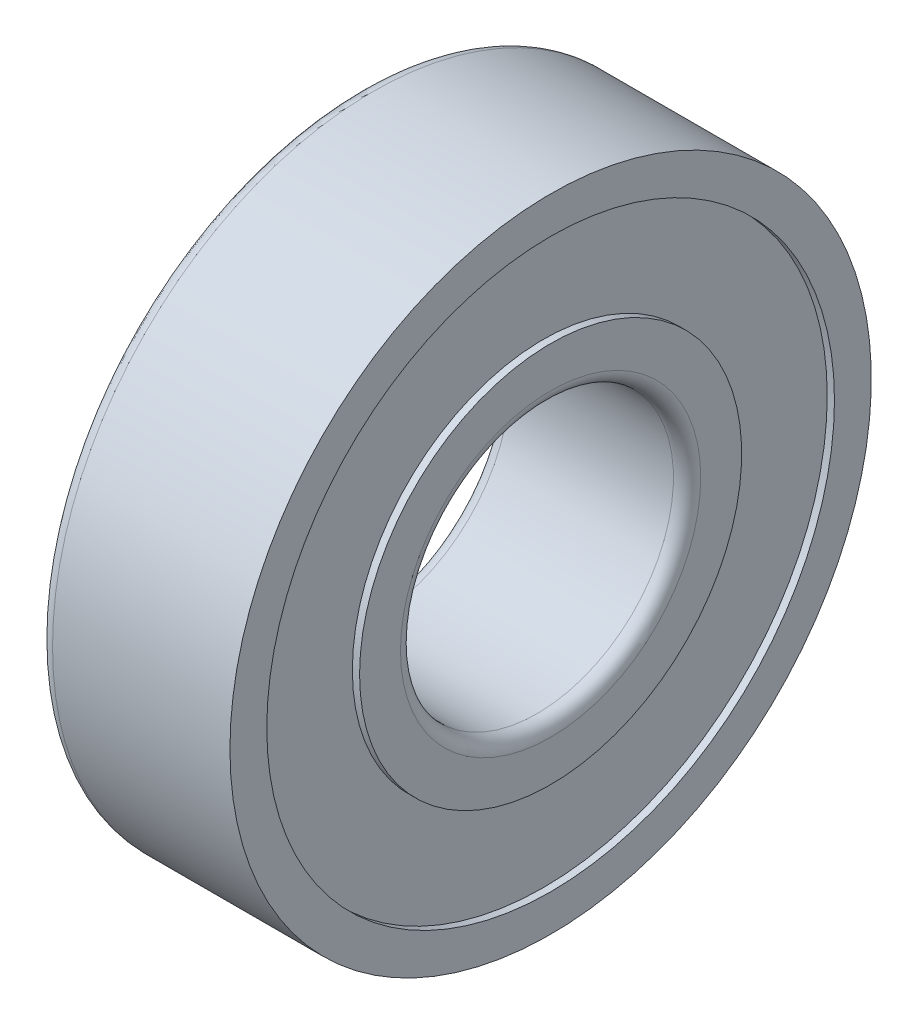
ISO-10303-21;
HEADER;
FILE_DESCRIPTION(('STEP AP214'),'2;1');
FILE_NAME('part.step','',(''),(''),'','','');
FILE_SCHEMA(('AUTOMOTIVE_DESIGN { 1 0 10303 214 1 1 1 1 }'));
ENDSEC;
DATA;
#1=APPLICATION_CONTEXT('core data for automotive mechanical design processes');
#2=APPLICATION_PROTOCOL_DEFINITION('international standard','automotive_design',2000,#1);
#3=PRODUCT_CONTEXT('',#1,'mechanical');
#4=PRODUCT('Part','Part','',(#3));
#5=PRODUCT_RELATED_PRODUCT_CATEGORY('part','',(#4));
#6=PRODUCT_DEFINITION_FORMATION('','',#4);
#7=PRODUCT_DEFINITION_CONTEXT('part definition',#1,'design');
#8=PRODUCT_DEFINITION('design','',#6,#7);
#9=PRODUCT_DEFINITION_SHAPE('','',#8);
#10=(LENGTH_UNIT() NAMED_UNIT(*) SI_UNIT(.MILLI.,.METRE.));
#11=(NAMED_UNIT(*) PLANE_ANGLE_UNIT() SI_UNIT($,.RADIAN.));
#12=(NAMED_UNIT(*) SI_UNIT($,.STERADIAN.) SOLID_ANGLE_UNIT());
#13=UNCERTAINTY_MEASURE_WITH_UNIT(LENGTH_MEASURE(1.E-05),#10,'distance_accuracy_value','');
#14=(GEOMETRIC_REPRESENTATION_CONTEXT(3) GLOBAL_UNCERTAINTY_ASSIGNED_CONTEXT((#13)) GLOBAL_UNIT_ASSIGNED_CONTEXT((#10,
#11,#12)) REPRESENTATION_CONTEXT('',''));
#15=CARTESIAN_POINT('',(0.,0.,0.));
#16=DIRECTION('',(0.,0.,1.));
#17=DIRECTION('',(1.,0.,0.));
#18=AXIS2_PLACEMENT_3D('',#15,#16,#17);
#19=CARTESIAN_POINT('',(-6.,0.,0.));
#20=DIRECTION('',(1.,0.,0.));
#21=DIRECTION('',(0.,0.,1.));
#22=AXIS2_PLACEMENT_3D('',#19,#20,#21);
#23=TOROIDAL_SURFACE('',#22,11.,1.);
#24=CARTESIAN_POINT('',(-6.,0.,0.));
#25=DIRECTION('',(-1.,0.,0.));
#26=DIRECTION('',(0.,0.,1.));
#27=AXIS2_PLACEMENT_3D('',#24,#25,#26);
#28=CIRCLE('',#27,10.);
#29=CARTESIAN_POINT('',(-6.,0.,10.));
#30=VERTEX_POINT('',#29);
#31=EDGE_CURVE('E313',#30,#30,#28,.F.);
#32=ORIENTED_EDGE('',*,*,#31,.T.);
#33=EDGE_LOOP('',(#32));
#34=FACE_BOUND('',#33,.T.);
#35=CARTESIAN_POINT('',(-7.,0.,0.));
#36=DIRECTION('',(-1.,0.,0.));
#37=DIRECTION('',(0.,0.,-1.));
#38=AXIS2_PLACEMENT_3D('',#35,#36,#37);
#39=CIRCLE('',#38,11.);
#40=CARTESIAN_POINT('',(-7.,-11.,0.));
#41=VERTEX_POINT('',#40);
#42=CARTESIAN_POINT('',(-7.,0.,-11.));
#43=VERTEX_POINT('',#42);
#44=EDGE_CURVE('E67',#41,#43,#39,.F.);
#45=ORIENTED_EDGE('',*,*,#44,.F.);
#46=CARTESIAN_POINT('',(-7.,0.,0.));
#47=DIRECTION('',(-1.,0.,0.));
#48=DIRECTION('',(0.,-1.,0.));
#49=AXIS2_PLACEMENT_3D('',#46,#47,#48);
#50=CIRCLE('',#49,11.);
#51=CARTESIAN_POINT('',(-7.,0.,11.));
#52=VERTEX_POINT('',#51);
#53=EDGE_CURVE('E65',#52,#41,#50,.F.);
#54=ORIENTED_EDGE('',*,*,#53,.F.);
#55=CARTESIAN_POINT('',(-7.,0.,0.));
#56=DIRECTION('',(-1.,0.,0.));
#57=DIRECTION('',(0.,0.,1.));
#58=AXIS2_PLACEMENT_3D('',#55,#56,#57);
#59=CIRCLE('',#58,11.);
#60=EDGE_CURVE('E62',#43,#52,#59,.F.);
#61=ORIENTED_EDGE('',*,*,#60,.F.);
#62=EDGE_LOOP('',(#45,#54,#61));
#63=FACE_BOUND('',#62,.T.);
#64=ADVANCED_FACE('F17',(#34,#63),#23,.T.);
#65=CARTESIAN_POINT('',(0.,0.,0.));
#66=DIRECTION('',(-1.,0.,0.));
#67=DIRECTION('',(0.,0.,1.));
#68=AXIS2_PLACEMENT_3D('',#65,#66,#67);
#69=CYLINDRICAL_SURFACE('',#68,10.);
#70=CARTESIAN_POINT('',(6.,0.,0.));
#71=DIRECTION('',(1.,0.,0.));
#72=DIRECTION('',(0.,0.,1.));
#73=AXIS2_PLACEMENT_3D('',#70,#71,#72);
#74=CIRCLE('',#73,10.);
#75=CARTESIAN_POINT('',(6.,0.,10.));
#76=VERTEX_POINT('',#75);
#77=EDGE_CURVE('E71',#76,#76,#74,.F.);
#78=ORIENTED_EDGE('',*,*,#77,.F.);
#79=EDGE_LOOP('',(#78));
#80=FACE_BOUND('',#79,.T.);
#81=ORIENTED_EDGE('',*,*,#31,.F.);
#82=EDGE_LOOP('',(#81));
#83=FACE_BOUND('',#82,.T.);
#84=ADVANCED_FACE('F95',(#80,#83),#69,.F.);
#85=CARTESIAN_POINT('',(-7.,-12.5,0.));
#86=DIRECTION('',(-1.,0.,0.));
#87=DIRECTION('',(0.,0.,1.));
#88=AXIS2_PLACEMENT_3D('',#85,#86,#87);
#89=PLANE('',#88);
#90=ORIENTED_EDGE('',*,*,#60,.T.);
#91=ORIENTED_EDGE('',*,*,#53,.T.);
#92=ORIENTED_EDGE('',*,*,#44,.T.);
#93=EDGE_LOOP('',(#90,#91,#92));
#94=FACE_BOUND('',#93,.T.);
#95=CARTESIAN_POINT('',(-7.,0.,0.));
#96=DIRECTION('',(-1.,0.,0.));
#97=DIRECTION('',(0.,0.,1.));
#98=AXIS2_PLACEMENT_3D('',#95,#96,#97);
#99=CIRCLE('',#98,14.);
#100=CARTESIAN_POINT('',(-7.,0.,14.));
#101=VERTEX_POINT('',#100);
#102=EDGE_CURVE('E110',#101,#101,#99,.F.);
#103=ORIENTED_EDGE('',*,*,#102,.F.);
#104=EDGE_LOOP('',(#103));
#105=FACE_BOUND('',#104,.T.);
#106=ADVANCED_FACE('F74',(#94,#105),#89,.T.);
#107=CARTESIAN_POINT('',(6.,0.,0.));
#108=DIRECTION('',(1.,0.,0.));
#109=DIRECTION('',(0.,0.,1.));
#110=AXIS2_PLACEMENT_3D('',#107,#108,#109);
#111=TOROIDAL_SURFACE('',#110,11.,1.);
#112=ORIENTED_EDGE('',*,*,#77,.T.);
#113=EDGE_LOOP('',(#112));
#114=FACE_BOUND('',#113,.T.);
#115=CARTESIAN_POINT('',(7.,0.,0.));
#116=DIRECTION('',(1.,0.,0.));
#117=DIRECTION('',(0.,0.,-1.));
#118=AXIS2_PLACEMENT_3D('',#115,#116,#117);
#119=CIRCLE('',#118,11.);
#120=CARTESIAN_POINT('',(7.,0.,11.));
#121=VERTEX_POINT('',#120);
#122=CARTESIAN_POINT('',(7.,0.,-11.));
#123=VERTEX_POINT('',#122);
#124=EDGE_CURVE('E235',#121,#123,#119,.F.);
#125=ORIENTED_EDGE('',*,*,#124,.F.);
#126=CARTESIAN_POINT('',(7.,0.,0.));
#127=DIRECTION('',(1.,0.,0.));
#128=DIRECTION('',(0.,0.,1.));
#129=AXIS2_PLACEMENT_3D('',#126,#127,#128);
#130=CIRCLE('',#129,11.);
#131=CARTESIAN_POINT('',(7.,-11.,0.));
#132=VERTEX_POINT('',#131);
#133=EDGE_CURVE('E120',#132,#121,#130,.F.);
#134=ORIENTED_EDGE('',*,*,#133,.F.);
#135=CARTESIAN_POINT('',(7.,0.,0.));
#136=DIRECTION('',(1.,0.,0.));
#137=DIRECTION('',(0.,-1.,0.));
#138=AXIS2_PLACEMENT_3D('',#135,#136,#137);
#139=CIRCLE('',#138,11.);
#140=EDGE_CURVE('E115',#123,#132,#139,.F.);
#141=ORIENTED_EDGE('',*,*,#140,.F.);
#142=EDGE_LOOP('',(#125,#134,#141));
#143=FACE_BOUND('',#142,.T.);
#144=ADVANCED_FACE('F94',(#114,#143),#111,.T.);
#145=CARTESIAN_POINT('',(-6.735,0.,0.));
#146=DIRECTION('',(-1.,0.,0.));
#147=DIRECTION('',(0.,0.,1.));
#148=AXIS2_PLACEMENT_3D('',#145,#146,#147);
#149=CYLINDRICAL_SURFACE('',#148,14.);
#150=CARTESIAN_POINT('',(-6.47,0.,0.));
#151=DIRECTION('',(-1.,0.,0.));
#152=DIRECTION('',(0.,0.,1.));
#153=AXIS2_PLACEMENT_3D('',#150,#151,#152);
#154=CIRCLE('',#153,14.);
#155=CARTESIAN_POINT('',(-6.47,0.,14.));
#156=VERTEX_POINT('',#155);
#157=EDGE_CURVE('E123',#156,#156,#154,.F.);
#158=ORIENTED_EDGE('',*,*,#157,.F.);
#159=EDGE_LOOP('',(#158));
#160=FACE_BOUND('',#159,.T.);
#161=ORIENTED_EDGE('',*,*,#102,.T.);
#162=EDGE_LOOP('',(#161));
#163=FACE_BOUND('',#162,.T.);
#164=ADVANCED_FACE('F221',(#160,#163),#149,.T.);
#165=CARTESIAN_POINT('',(7.,-12.5,0.));
#166=DIRECTION('',(1.,0.,0.));
#167=DIRECTION('',(0.,0.,-1.));
#168=AXIS2_PLACEMENT_3D('',#165,#166,#167);
#169=PLANE('',#168);
#170=CARTESIAN_POINT('',(7.,0.,0.));
#171=DIRECTION('',(-1.,0.,0.));
#172=DIRECTION('',(0.,0.,1.));
#173=AXIS2_PLACEMENT_3D('',#170,#171,#172);
#174=CIRCLE('',#173,14.);
#175=CARTESIAN_POINT('',(7.,0.,14.));
#176=VERTEX_POINT('',#175);
#177=EDGE_CURVE('E265',#176,#176,#174,.T.);
#178=ORIENTED_EDGE('',*,*,#177,.F.);
#179=EDGE_LOOP('',(#178));
#180=FACE_BOUND('',#179,.T.);
#181=ORIENTED_EDGE('',*,*,#133,.T.);
#182=ORIENTED_EDGE('',*,*,#124,.T.);
#183=ORIENTED_EDGE('',*,*,#140,.T.);
#184=EDGE_LOOP('',(#181,#182,#183));
#185=FACE_BOUND('',#184,.T.);
#186=ADVANCED_FACE('F211',(#180,#185),#169,.T.);
#187=CARTESIAN_POINT('',(-6.47,-17.4,0.));
#188=DIRECTION('',(-1.,0.,0.));
#189=DIRECTION('',(0.,0.,1.));
#190=AXIS2_PLACEMENT_3D('',#187,#188,#189);
#191=PLANE('',#190);
#192=ORIENTED_EDGE('',*,*,#157,.T.);
#193=EDGE_LOOP('',(#192));
#194=FACE_BOUND('',#193,.T.);
#195=CARTESIAN_POINT('',(-6.47,0.,0.));
#196=DIRECTION('',(-1.,0.,0.));
#197=DIRECTION('',(0.,0.,1.));
#198=AXIS2_PLACEMENT_3D('',#195,#196,#197);
#199=CIRCLE('',#198,20.8);
#200=CARTESIAN_POINT('',(-6.47,0.,20.8));
#201=VERTEX_POINT('',#200);
#202=EDGE_CURVE('E269',#201,#201,#199,.T.);
#203=ORIENTED_EDGE('',*,*,#202,.T.);
#204=EDGE_LOOP('',(#203));
#205=FACE_BOUND('',#204,.T.);
#206=ADVANCED_FACE('F220',(#194,#205),#191,.T.);
#207=CARTESIAN_POINT('',(6.735,0.,0.));
#208=DIRECTION('',(-1.,0.,0.));
#209=DIRECTION('',(0.,0.,1.));
#210=AXIS2_PLACEMENT_3D('',#207,#208,#209);
#211=CYLINDRICAL_SURFACE('',#210,14.);
#212=ORIENTED_EDGE('',*,*,#177,.T.);
#213=EDGE_LOOP('',(#212));
#214=FACE_BOUND('',#213,.T.);
#215=CARTESIAN_POINT('',(6.47,0.,0.));
#216=DIRECTION('',(-1.,0.,0.));
#217=DIRECTION('',(0.,0.,1.));
#218=AXIS2_PLACEMENT_3D('',#215,#216,#217);
#219=CIRCLE('',#218,14.);
#220=CARTESIAN_POINT('',(6.47,0.,14.));
#221=VERTEX_POINT('',#220);
#222=EDGE_CURVE('E270',#221,#221,#219,.T.);
#223=ORIENTED_EDGE('',*,*,#222,.F.);
#224=EDGE_LOOP('',(#223));
#225=FACE_BOUND('',#224,.T.);
#226=ADVANCED_FACE('F368',(#214,#225),#211,.T.);
#227=CARTESIAN_POINT('',(-6.735,0.,0.));
#228=DIRECTION('',(-1.,0.,0.));
#229=DIRECTION('',(0.,0.,1.));
#230=AXIS2_PLACEMENT_3D('',#227,#228,#229);
#231=CYLINDRICAL_SURFACE('',#230,20.8);
#232=CARTESIAN_POINT('',(-7.,0.,0.));
#233=DIRECTION('',(-1.,0.,0.));
#234=DIRECTION('',(0.,0.,1.));
#235=AXIS2_PLACEMENT_3D('',#232,#233,#234);
#236=CIRCLE('',#235,20.8);
#237=CARTESIAN_POINT('',(-7.,0.,20.8));
#238=VERTEX_POINT('',#237);
#239=EDGE_CURVE('E273',#238,#238,#236,.F.);
#240=ORIENTED_EDGE('',*,*,#239,.F.);
#241=EDGE_LOOP('',(#240));
#242=FACE_BOUND('',#241,.T.);
#243=ORIENTED_EDGE('',*,*,#202,.F.);
#244=EDGE_LOOP('',(#243));
#245=FACE_BOUND('',#244,.T.);
#246=ADVANCED_FACE('F363',(#242,#245),#231,.F.);
#247=CARTESIAN_POINT('',(6.47,-17.4,0.));
#248=DIRECTION('',(1.,0.,0.));
#249=DIRECTION('',(0.,0.,-1.));
#250=AXIS2_PLACEMENT_3D('',#247,#248,#249);
#251=PLANE('',#250);
#252=CARTESIAN_POINT('',(6.47,0.,0.));
#253=DIRECTION('',(-1.,0.,0.));
#254=DIRECTION('',(0.,0.,1.));
#255=AXIS2_PLACEMENT_3D('',#252,#253,#254);
#256=CIRCLE('',#255,20.8);
#257=CARTESIAN_POINT('',(6.47,0.,20.8));
#258=VERTEX_POINT('',#257);
#259=EDGE_CURVE('E304',#258,#258,#256,.F.);
#260=ORIENTED_EDGE('',*,*,#259,.T.);
#261=EDGE_LOOP('',(#260));
#262=FACE_BOUND('',#261,.T.);
#263=ORIENTED_EDGE('',*,*,#222,.T.);
#264=EDGE_LOOP('',(#263));
#265=FACE_BOUND('',#264,.T.);
#266=ADVANCED_FACE('F171',(#262,#265),#251,.T.);
#267=CARTESIAN_POINT('',(-7.,-21.65,0.));
#268=DIRECTION('',(-1.,0.,0.));
#269=DIRECTION('',(0.,0.,1.));
#270=AXIS2_PLACEMENT_3D('',#267,#268,#269);
#271=PLANE('',#270);
#272=ORIENTED_EDGE('',*,*,#239,.T.);
#273=EDGE_LOOP('',(#272));
#274=FACE_BOUND('',#273,.T.);
#275=CARTESIAN_POINT('',(-7.,0.,0.));
#276=DIRECTION('',(1.,0.,0.));
#277=DIRECTION('',(0.,0.,1.));
#278=AXIS2_PLACEMENT_3D('',#275,#276,#277);
#279=CIRCLE('',#278,22.5);
#280=CARTESIAN_POINT('',(-7.,0.,22.5));
#281=VERTEX_POINT('',#280);
#282=CARTESIAN_POINT('',(-7.,-22.5,0.));
#283=VERTEX_POINT('',#282);
#284=EDGE_CURVE('E126',#281,#283,#279,.T.);
#285=ORIENTED_EDGE('',*,*,#284,.F.);
#286=CARTESIAN_POINT('',(-7.,0.,0.));
#287=DIRECTION('',(1.,0.,0.));
#288=DIRECTION('',(0.,0.,-1.));
#289=AXIS2_PLACEMENT_3D('',#286,#287,#288);
#290=CIRCLE('',#289,22.5);
#291=CARTESIAN_POINT('',(-7.,0.,-22.5));
#292=VERTEX_POINT('',#291);
#293=EDGE_CURVE('E185',#292,#281,#290,.T.);
#294=ORIENTED_EDGE('',*,*,#293,.F.);
#295=CARTESIAN_POINT('',(-7.,0.,0.));
#296=DIRECTION('',(1.,0.,0.));
#297=DIRECTION('',(0.,-1.,0.));
#298=AXIS2_PLACEMENT_3D('',#295,#296,#297);
#299=CIRCLE('',#298,22.5);
#300=EDGE_CURVE('E38',#283,#292,#299,.T.);
#301=ORIENTED_EDGE('',*,*,#300,.F.);
#302=EDGE_LOOP('',(#285,#294,#301));
#303=FACE_BOUND('',#302,.T.);
#304=ADVANCED_FACE('F162',(#274,#303),#271,.T.);
#305=CARTESIAN_POINT('',(6.735,0.,0.));
#306=DIRECTION('',(-1.,0.,0.));
#307=DIRECTION('',(0.,0.,1.));
#308=AXIS2_PLACEMENT_3D('',#305,#306,#307);
#309=CYLINDRICAL_SURFACE('',#308,20.8);
#310=ORIENTED_EDGE('',*,*,#259,.F.);
#311=EDGE_LOOP('',(#310));
#312=FACE_BOUND('',#311,.T.);
#313=CARTESIAN_POINT('',(7.,0.,0.));
#314=DIRECTION('',(-1.,0.,0.));
#315=DIRECTION('',(0.,0.,1.));
#316=AXIS2_PLACEMENT_3D('',#313,#314,#315);
#317=CIRCLE('',#316,20.8);
#318=CARTESIAN_POINT('',(7.,0.,20.8));
#319=VERTEX_POINT('',#318);
#320=EDGE_CURVE('E155',#319,#319,#317,.T.);
#321=ORIENTED_EDGE('',*,*,#320,.F.);
#322=EDGE_LOOP('',(#321));
#323=FACE_BOUND('',#322,.T.);
#324=ADVANCED_FACE('F143',(#312,#323),#309,.F.);
#325=CARTESIAN_POINT('',(-6.,0.,0.));
#326=DIRECTION('',(1.,0.,0.));
#327=DIRECTION('',(0.,0.,1.));
#328=AXIS2_PLACEMENT_3D('',#325,#326,#327);
#329=TOROIDAL_SURFACE('',#328,22.5,1.);
#330=CARTESIAN_POINT('',(-6.,0.,0.));
#331=DIRECTION('',(-1.,0.,0.));
#332=DIRECTION('',(0.,0.,1.));
#333=AXIS2_PLACEMENT_3D('',#330,#331,#332);
#334=CIRCLE('',#333,23.5);
#335=CARTESIAN_POINT('',(-6.,0.,23.5));
#336=VERTEX_POINT('',#335);
#337=EDGE_CURVE('E29',#336,#336,#334,.F.);
#338=ORIENTED_EDGE('',*,*,#337,.F.);
#339=EDGE_LOOP('',(#338));
#340=FACE_BOUND('',#339,.T.);
#341=ORIENTED_EDGE('',*,*,#293,.T.);
#342=ORIENTED_EDGE('',*,*,#284,.T.);
#343=ORIENTED_EDGE('',*,*,#300,.T.);
#344=EDGE_LOOP('',(#341,#342,#343));
#345=FACE_BOUND('',#344,.T.);
#346=ADVANCED_FACE('F131',(#340,#345),#329,.T.);
#347=CARTESIAN_POINT('',(7.,-22.15,0.));
#348=DIRECTION('',(1.,0.,0.));
#349=DIRECTION('',(0.,0.,-1.));
#350=AXIS2_PLACEMENT_3D('',#347,#348,#349);
#351=PLANE('',#350);
#352=CARTESIAN_POINT('',(7.,0.,0.));
#353=DIRECTION('',(-1.,0.,0.));
#354=DIRECTION('',(0.,0.,1.));
#355=AXIS2_PLACEMENT_3D('',#352,#353,#354);
#356=CIRCLE('',#355,23.5);
#357=CARTESIAN_POINT('',(7.,0.,23.5));
#358=VERTEX_POINT('',#357);
#359=EDGE_CURVE('E11',#358,#358,#356,.T.);
#360=ORIENTED_EDGE('',*,*,#359,.F.);
#361=EDGE_LOOP('',(#360));
#362=FACE_BOUND('',#361,.T.);
#363=ORIENTED_EDGE('',*,*,#320,.T.);
#364=EDGE_LOOP('',(#363));
#365=FACE_BOUND('',#364,.T.);
#366=ADVANCED_FACE('F142',(#362,#365),#351,.T.);
#367=CARTESIAN_POINT('',(0.5,0.,0.));
#368=DIRECTION('',(-1.,0.,0.));
#369=DIRECTION('',(0.,0.,1.));
#370=AXIS2_PLACEMENT_3D('',#367,#368,#369);
#371=CYLINDRICAL_SURFACE('',#370,23.5);
#372=ORIENTED_EDGE('',*,*,#337,.T.);
#373=EDGE_LOOP('',(#372));
#374=FACE_BOUND('',#373,.T.);
#375=ORIENTED_EDGE('',*,*,#359,.T.);
#376=EDGE_LOOP('',(#375));
#377=FACE_BOUND('',#376,.T.);
#378=ADVANCED_FACE('F341',(#374,#377),#371,.T.);
#379=CLOSED_SHELL('',(#64,#84,#106,#144,#164,#186,#206,#226,#246,#266,#304,#324,#346,#366,#378));
#380=MANIFOLD_SOLID_BREP('B1',#379);
#381=ADVANCED_BREP_SHAPE_REPRESENTATION('',(#18,#380),#14);
#382=SHAPE_DEFINITION_REPRESENTATION(#9,#381);
ENDSEC;
END-ISO-10303-21;
